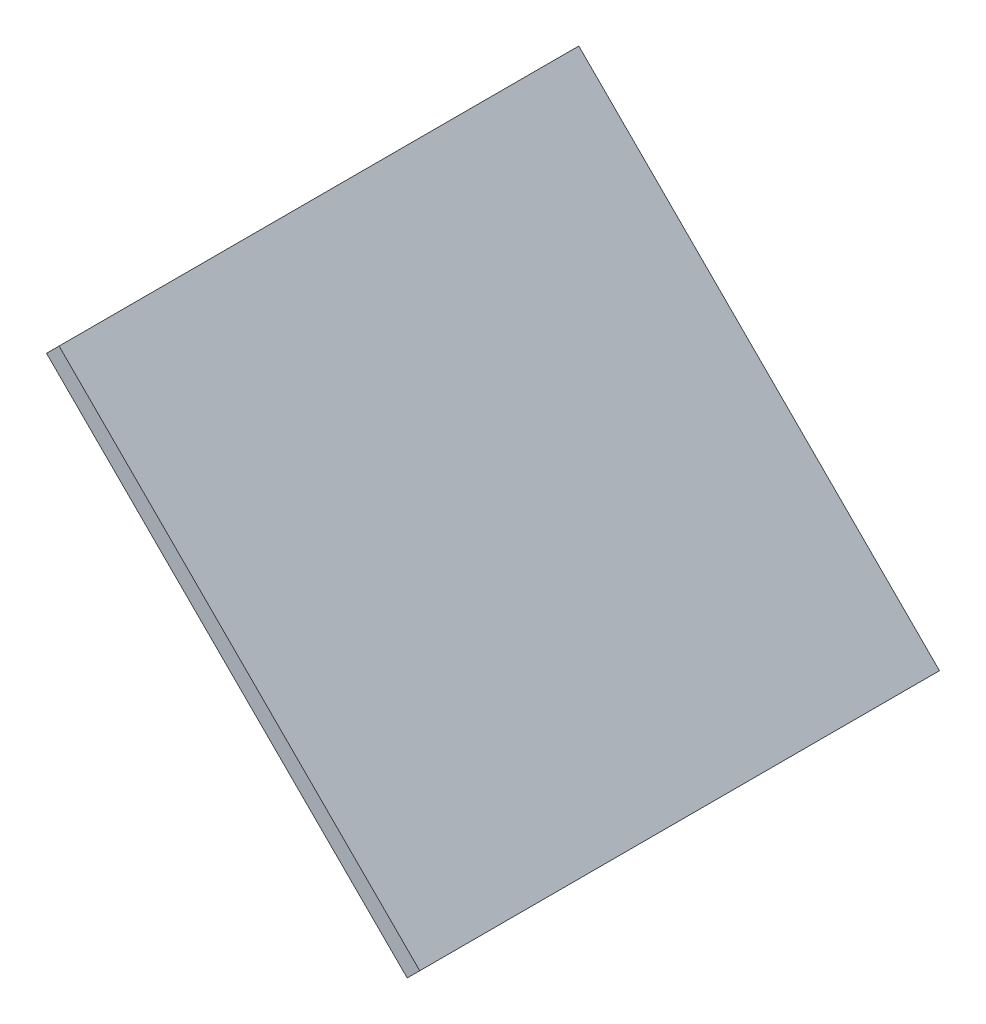
ISO-10303-21;
HEADER;
FILE_DESCRIPTION(('STEP AP214'),'2;1');
FILE_NAME('part.step','',(''),(''),'','','');
FILE_SCHEMA(('AUTOMOTIVE_DESIGN { 1 0 10303 214 1 1 1 1 }'));
ENDSEC;
DATA;
#1=APPLICATION_CONTEXT('core data for automotive mechanical design processes');
#2=APPLICATION_PROTOCOL_DEFINITION('international standard','automotive_design',2000,#1);
#3=PRODUCT_CONTEXT('',#1,'mechanical');
#4=PRODUCT('Part','Part','',(#3));
#5=PRODUCT_RELATED_PRODUCT_CATEGORY('part','',(#4));
#6=PRODUCT_DEFINITION_FORMATION('','',#4);
#7=PRODUCT_DEFINITION_CONTEXT('part definition',#1,'design');
#8=PRODUCT_DEFINITION('design','',#6,#7);
#9=PRODUCT_DEFINITION_SHAPE('','',#8);
#10=(LENGTH_UNIT() NAMED_UNIT(*) SI_UNIT(.MILLI.,.METRE.));
#11=(NAMED_UNIT(*) PLANE_ANGLE_UNIT() SI_UNIT($,.RADIAN.));
#12=(NAMED_UNIT(*) SI_UNIT($,.STERADIAN.) SOLID_ANGLE_UNIT());
#13=UNCERTAINTY_MEASURE_WITH_UNIT(LENGTH_MEASURE(1.E-05),#10,'distance_accuracy_value','');
#14=(GEOMETRIC_REPRESENTATION_CONTEXT(3) GLOBAL_UNCERTAINTY_ASSIGNED_CONTEXT((#13)) GLOBAL_UNIT_ASSIGNED_CONTEXT((#10,
#11,#12)) REPRESENTATION_CONTEXT('',''));
#15=CARTESIAN_POINT('',(0.,0.,0.));
#16=DIRECTION('',(0.,0.,1.));
#17=DIRECTION('',(1.,0.,0.));
#18=AXIS2_PLACEMENT_3D('',#15,#16,#17);
#19=CARTESIAN_POINT('',(657.930504165524,657.930504165525,558.8));
#20=DIRECTION('',(-0.707106781186548,-0.707106781186548,0.));
#21=DIRECTION('',(0.707106781186548,-0.707106781186547,0.));
#22=AXIS2_PLACEMENT_3D('',#19,#20,#21);
#23=PLANE('',#22);
#24=DIRECTION('',(-0.707106781186548,0.707106781186547,0.));
#25=VECTOR('',#24,1.);
#26=CARTESIAN_POINT('',(657.930504165524,657.930504165525,0.));
#27=LINE('',#26,#25);
#28=CARTESIAN_POINT('',(-140.284498249527,1456.14550658058,0.));
#29=VERTEX_POINT('',#28);
#30=CARTESIAN_POINT('',(-528.085778854873,1843.94678718592,0.));
#31=VERTEX_POINT('',#30);
#32=EDGE_CURVE('E96',#29,#31,#27,.T.);
#33=ORIENTED_EDGE('',*,*,#32,.F.);
#34=DIRECTION('',(0.,0.,-1.));
#35=VECTOR('',#34,1.);
#36=CARTESIAN_POINT('',(-140.284498249527,1456.14550658058,558.8));
#37=LINE('',#36,#35);
#38=CARTESIAN_POINT('',(-140.284498249527,1456.14550658058,558.8));
#39=VERTEX_POINT('',#38);
#40=EDGE_CURVE('E11',#39,#29,#37,.T.);
#41=ORIENTED_EDGE('',*,*,#40,.F.);
#42=DIRECTION('',(-0.707106781186548,0.707106781186547,0.));
#43=VECTOR('',#42,1.);
#44=CARTESIAN_POINT('',(657.930504165524,657.930504165525,558.8));
#45=LINE('',#44,#43);
#46=CARTESIAN_POINT('',(-528.085778854873,1843.94678718592,558.8));
#47=VERTEX_POINT('',#46);
#48=EDGE_CURVE('E90',#39,#47,#45,.T.);
#49=ORIENTED_EDGE('',*,*,#48,.T.);
#50=DIRECTION('',(0.,0.,-1.));
#51=VECTOR('',#50,1.);
#52=CARTESIAN_POINT('',(-528.085778854873,1843.94678718592,558.8));
#53=LINE('',#52,#51);
#54=EDGE_CURVE('E71',#47,#31,#53,.T.);
#55=ORIENTED_EDGE('',*,*,#54,.T.);
#56=EDGE_LOOP('',(#33,#41,#49,#55));
#57=FACE_BOUND('',#56,.T.);
#58=ADVANCED_FACE('F33',(#57),#23,.T.);
#59=CARTESIAN_POINT('',(-798.215002415052,798.215002415052,558.8));
#60=DIRECTION('',(0.707106781186548,-0.707106781186548,0.));
#61=DIRECTION('',(0.707106781186548,0.707106781186548,0.));
#62=AXIS2_PLACEMENT_3D('',#59,#60,#61);
#63=PLANE('',#62);
#64=DIRECTION('',(-0.707106781186548,-0.707106781186548,0.));
#65=VECTOR('',#64,1.);
#66=CARTESIAN_POINT('',(-798.215002415052,798.215002415052,0.));
#67=LINE('',#66,#65);
#68=CARTESIAN_POINT('',(-126.814114067924,1469.61589076218,0.));
#69=VERTEX_POINT('',#68);
#70=EDGE_CURVE('E84',#69,#29,#67,.T.);
#71=ORIENTED_EDGE('',*,*,#70,.F.);
#72=DIRECTION('',(0.,0.,-1.));
#73=VECTOR('',#72,1.);
#74=CARTESIAN_POINT('',(-126.814114067924,1469.61589076218,558.8));
#75=LINE('',#74,#73);
#76=CARTESIAN_POINT('',(-126.814114067924,1469.61589076218,558.8));
#77=VERTEX_POINT('',#76);
#78=EDGE_CURVE('E41',#77,#69,#75,.T.);
#79=ORIENTED_EDGE('',*,*,#78,.F.);
#80=DIRECTION('',(-0.707106781186548,-0.707106781186548,0.));
#81=VECTOR('',#80,1.);
#82=CARTESIAN_POINT('',(-798.215002415052,798.215002415052,558.8));
#83=LINE('',#82,#81);
#84=EDGE_CURVE('E82',#77,#39,#83,.T.);
#85=ORIENTED_EDGE('',*,*,#84,.T.);
#86=ORIENTED_EDGE('',*,*,#40,.T.);
#87=EDGE_LOOP('',(#71,#79,#85,#86));
#88=FACE_BOUND('',#87,.T.);
#89=ADVANCED_FACE('F80',(#88),#63,.T.);
#90=CARTESIAN_POINT('',(671.400888347128,671.400888347128,558.8));
#91=DIRECTION('',(-0.707106781186548,-0.707106781186548,0.));
#92=DIRECTION('',(0.707106781186548,-0.707106781186547,0.));
#93=AXIS2_PLACEMENT_3D('',#90,#91,#92);
#94=PLANE('',#93);
#95=DIRECTION('',(-0.707106781186548,0.707106781186547,0.));
#96=VECTOR('',#95,1.);
#97=CARTESIAN_POINT('',(671.400888347128,671.400888347128,0.));
#98=LINE('',#97,#96);
#99=CARTESIAN_POINT('',(-514.61539467327,1857.41717136753,0.));
#100=VERTEX_POINT('',#99);
#101=EDGE_CURVE('E64',#69,#100,#98,.T.);
#102=ORIENTED_EDGE('',*,*,#101,.T.);
#103=DIRECTION('',(0.,0.,-1.));
#104=VECTOR('',#103,1.);
#105=CARTESIAN_POINT('',(-514.61539467327,1857.41717136753,558.8));
#106=LINE('',#105,#104);
#107=CARTESIAN_POINT('',(-514.61539467327,1857.41717136753,558.8));
#108=VERTEX_POINT('',#107);
#109=EDGE_CURVE('E85',#108,#100,#106,.T.);
#110=ORIENTED_EDGE('',*,*,#109,.F.);
#111=DIRECTION('',(-0.707106781186548,0.707106781186547,0.));
#112=VECTOR('',#111,1.);
#113=CARTESIAN_POINT('',(671.400888347128,671.400888347128,558.8));
#114=LINE('',#113,#112);
#115=EDGE_CURVE('E86',#77,#108,#114,.T.);
#116=ORIENTED_EDGE('',*,*,#115,.F.);
#117=ORIENTED_EDGE('',*,*,#78,.T.);
#118=EDGE_LOOP('',(#102,#110,#116,#117));
#119=FACE_BOUND('',#118,.T.);
#120=ADVANCED_FACE('F87',(#119),#94,.F.);
#121=CARTESIAN_POINT('',(-1186.0162830204,1186.0162830204,558.8));
#122=DIRECTION('',(0.707106781186548,-0.707106781186548,0.));
#123=DIRECTION('',(0.707106781186548,0.707106781186548,0.));
#124=AXIS2_PLACEMENT_3D('',#121,#122,#123);
#125=PLANE('',#124);
#126=DIRECTION('',(-0.707106781186548,-0.707106781186548,0.));
#127=VECTOR('',#126,1.);
#128=CARTESIAN_POINT('',(-1186.0162830204,1186.0162830204,0.));
#129=LINE('',#128,#127);
#130=EDGE_CURVE('E92',#100,#31,#129,.T.);
#131=ORIENTED_EDGE('',*,*,#130,.T.);
#132=ORIENTED_EDGE('',*,*,#54,.F.);
#133=DIRECTION('',(-0.707106781186548,-0.707106781186548,0.));
#134=VECTOR('',#133,1.);
#135=CARTESIAN_POINT('',(-1186.0162830204,1186.0162830204,558.8));
#136=LINE('',#135,#134);
#137=EDGE_CURVE('E49',#108,#47,#136,.T.);
#138=ORIENTED_EDGE('',*,*,#137,.F.);
#139=ORIENTED_EDGE('',*,*,#109,.T.);
#140=EDGE_LOOP('',(#131,#132,#138,#139));
#141=FACE_BOUND('',#140,.T.);
#142=ADVANCED_FACE('F105',(#141),#125,.F.);
#143=CARTESIAN_POINT('',(0.,0.,558.8));
#144=DIRECTION('',(0.,0.,1.));
#145=DIRECTION('',(1.,0.,0.));
#146=AXIS2_PLACEMENT_3D('',#143,#144,#145);
#147=PLANE('',#146);
#148=ORIENTED_EDGE('',*,*,#48,.F.);
#149=ORIENTED_EDGE('',*,*,#84,.F.);
#150=ORIENTED_EDGE('',*,*,#115,.T.);
#151=ORIENTED_EDGE('',*,*,#137,.T.);
#152=EDGE_LOOP('',(#148,#149,#150,#151));
#153=FACE_BOUND('',#152,.T.);
#154=ADVANCED_FACE('F89',(#153),#147,.T.);
#155=CARTESIAN_POINT('',(0.,0.,0.));
#156=DIRECTION('',(0.,0.,1.));
#157=DIRECTION('',(1.,0.,0.));
#158=AXIS2_PLACEMENT_3D('',#155,#156,#157);
#159=PLANE('',#158);
#160=ORIENTED_EDGE('',*,*,#32,.T.);
#161=ORIENTED_EDGE('',*,*,#130,.F.);
#162=ORIENTED_EDGE('',*,*,#101,.F.);
#163=ORIENTED_EDGE('',*,*,#70,.T.);
#164=EDGE_LOOP('',(#160,#161,#162,#163));
#165=FACE_BOUND('',#164,.T.);
#166=ADVANCED_FACE('F107',(#165),#159,.F.);
#167=CLOSED_SHELL('',(#58,#89,#120,#142,#154,#166));
#168=MANIFOLD_SOLID_BREP('B2',#167);
#169=ADVANCED_BREP_SHAPE_REPRESENTATION('',(#18,#168),#14);
#170=SHAPE_DEFINITION_REPRESENTATION(#9,#169);
ENDSEC;
END-ISO-10303-21;
